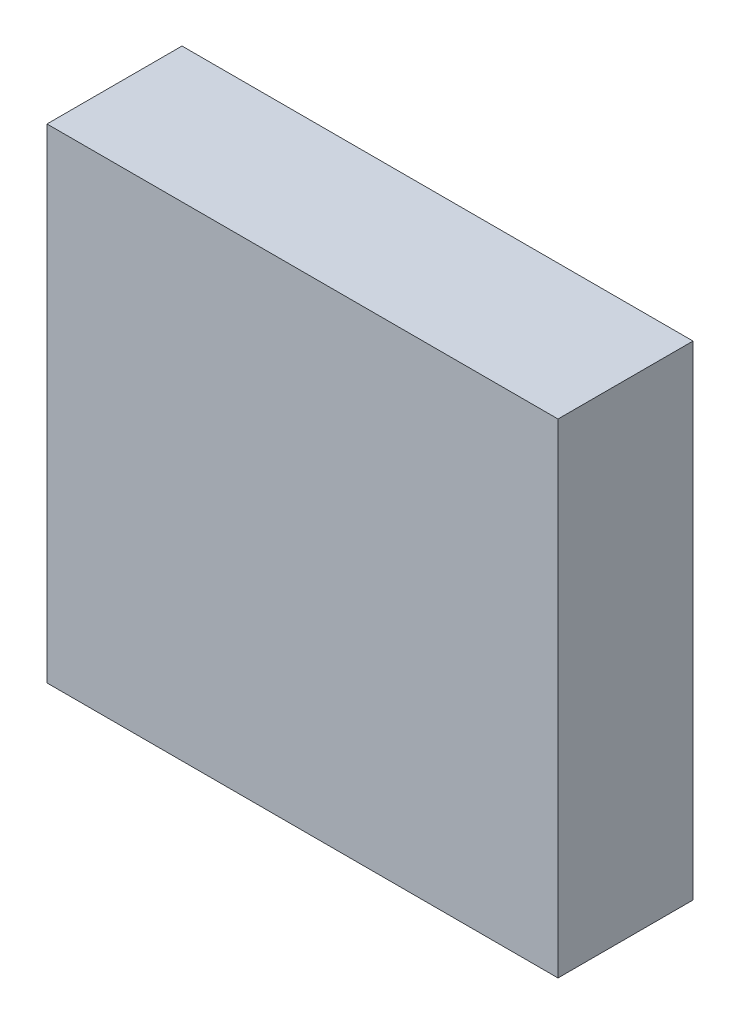
ISO-10303-21;
HEADER;
FILE_DESCRIPTION(('STEP AP214'),'2;1');
FILE_NAME('part.step','',(''),(''),'','','');
FILE_SCHEMA(('AUTOMOTIVE_DESIGN { 1 0 10303 214 1 1 1 1 }'));
ENDSEC;
DATA;
#1=APPLICATION_CONTEXT('core data for automotive mechanical design processes');
#2=APPLICATION_PROTOCOL_DEFINITION('international standard','automotive_design',2000,#1);
#3=PRODUCT_CONTEXT('',#1,'mechanical');
#4=PRODUCT('Part','Part','',(#3));
#5=PRODUCT_RELATED_PRODUCT_CATEGORY('part','',(#4));
#6=PRODUCT_DEFINITION_FORMATION('','',#4);
#7=PRODUCT_DEFINITION_CONTEXT('part definition',#1,'design');
#8=PRODUCT_DEFINITION('design','',#6,#7);
#9=PRODUCT_DEFINITION_SHAPE('','',#8);
#10=(LENGTH_UNIT() NAMED_UNIT(*) SI_UNIT(.MILLI.,.METRE.));
#11=(NAMED_UNIT(*) PLANE_ANGLE_UNIT() SI_UNIT($,.RADIAN.));
#12=(NAMED_UNIT(*) SI_UNIT($,.STERADIAN.) SOLID_ANGLE_UNIT());
#13=UNCERTAINTY_MEASURE_WITH_UNIT(LENGTH_MEASURE(1.E-05),#10,'distance_accuracy_value','');
#14=(GEOMETRIC_REPRESENTATION_CONTEXT(3) GLOBAL_UNCERTAINTY_ASSIGNED_CONTEXT((#13)) GLOBAL_UNIT_ASSIGNED_CONTEXT((#10,
#11,#12)) REPRESENTATION_CONTEXT('',''));
#15=CARTESIAN_POINT('',(0.,0.,0.));
#16=DIRECTION('',(0.,0.,1.));
#17=DIRECTION('',(1.,0.,0.));
#18=AXIS2_PLACEMENT_3D('',#15,#16,#17);
#19=CARTESIAN_POINT('',(0.,0.,0.));
#20=DIRECTION('',(0.,0.,-1.));
#21=DIRECTION('',(-1.,0.,0.));
#22=AXIS2_PLACEMENT_3D('',#19,#20,#21);
#23=PLANE('',#22);
#24=DIRECTION('',(0.,-1.,0.));
#25=VECTOR('',#24,1.);
#26=CARTESIAN_POINT('',(-47.5,45.,0.));
#27=LINE('',#26,#25);
#28=CARTESIAN_POINT('',(-47.5,45.,0.));
#29=VERTEX_POINT('',#28);
#30=CARTESIAN_POINT('',(-47.5,-45.,0.));
#31=VERTEX_POINT('',#30);
#32=EDGE_CURVE('E136',#29,#31,#27,.T.);
#33=ORIENTED_EDGE('',*,*,#32,.F.);
#34=DIRECTION('',(-1.,0.,0.));
#35=VECTOR('',#34,1.);
#36=CARTESIAN_POINT('',(47.5,45.,0.));
#37=LINE('',#36,#35);
#38=CARTESIAN_POINT('',(47.5,45.,0.));
#39=VERTEX_POINT('',#38);
#40=EDGE_CURVE('E84',#39,#29,#37,.T.);
#41=ORIENTED_EDGE('',*,*,#40,.F.);
#42=DIRECTION('',(0.,1.,0.));
#43=VECTOR('',#42,1.);
#44=CARTESIAN_POINT('',(47.5,45.,0.));
#45=LINE('',#44,#43);
#46=CARTESIAN_POINT('',(47.5,-45.,0.));
#47=VERTEX_POINT('',#46);
#48=EDGE_CURVE('E164',#47,#39,#45,.T.);
#49=ORIENTED_EDGE('',*,*,#48,.F.);
#50=DIRECTION('',(1.,0.,0.));
#51=VECTOR('',#50,1.);
#52=CARTESIAN_POINT('',(47.5,-45.,0.));
#53=LINE('',#52,#51);
#54=EDGE_CURVE('E140',#31,#47,#53,.T.);
#55=ORIENTED_EDGE('',*,*,#54,.F.);
#56=EDGE_LOOP('',(#33,#41,#49,#55));
#57=FACE_BOUND('',#56,.T.);
#58=DIRECTION('',(-1.,0.,0.));
#59=VECTOR('',#58,1.);
#60=CARTESIAN_POINT('',(0.,37.18,0.));
#61=LINE('',#60,#59);
#62=CARTESIAN_POINT('',(39.68,37.18,0.));
#63=VERTEX_POINT('',#62);
#64=CARTESIAN_POINT('',(-39.68,37.18,0.));
#65=VERTEX_POINT('',#64);
#66=EDGE_CURVE('E131',#63,#65,#61,.T.);
#67=ORIENTED_EDGE('',*,*,#66,.T.);
#68=DIRECTION('',(0.,-1.,0.));
#69=VECTOR('',#68,1.);
#70=CARTESIAN_POINT('',(-39.68,0.,0.));
#71=LINE('',#70,#69);
#72=CARTESIAN_POINT('',(-39.68,-37.18,0.));
#73=VERTEX_POINT('',#72);
#74=EDGE_CURVE('E150',#65,#73,#71,.T.);
#75=ORIENTED_EDGE('',*,*,#74,.T.);
#76=DIRECTION('',(1.,0.,0.));
#77=VECTOR('',#76,1.);
#78=CARTESIAN_POINT('',(0.,-37.18,0.));
#79=LINE('',#78,#77);
#80=CARTESIAN_POINT('',(39.68,-37.18,0.));
#81=VERTEX_POINT('',#80);
#82=EDGE_CURVE('E135',#73,#81,#79,.T.);
#83=ORIENTED_EDGE('',*,*,#82,.T.);
#84=DIRECTION('',(0.,1.,0.));
#85=VECTOR('',#84,1.);
#86=CARTESIAN_POINT('',(39.68,0.,0.));
#87=LINE('',#86,#85);
#88=EDGE_CURVE('E54',#81,#63,#87,.T.);
#89=ORIENTED_EDGE('',*,*,#88,.T.);
#90=EDGE_LOOP('',(#67,#75,#83,#89));
#91=FACE_BOUND('',#90,.T.);
#92=ADVANCED_FACE('F39',(#57,#91),#23,.T.);
#93=CARTESIAN_POINT('',(-47.5,45.,25.1));
#94=DIRECTION('',(1.,0.,0.));
#95=DIRECTION('',(0.,1.,0.));
#96=AXIS2_PLACEMENT_3D('',#93,#94,#95);
#97=PLANE('',#96);
#98=ORIENTED_EDGE('',*,*,#32,.T.);
#99=DIRECTION('',(0.,0.,-1.));
#100=VECTOR('',#99,1.);
#101=CARTESIAN_POINT('',(-47.5,-45.,25.1));
#102=LINE('',#101,#100);
#103=CARTESIAN_POINT('',(-47.5,-45.,25.1));
#104=VERTEX_POINT('',#103);
#105=EDGE_CURVE('E11',#104,#31,#102,.T.);
#106=ORIENTED_EDGE('',*,*,#105,.F.);
#107=DIRECTION('',(0.,-1.,0.));
#108=VECTOR('',#107,1.);
#109=CARTESIAN_POINT('',(-47.5,45.,25.1));
#110=LINE('',#109,#108);
#111=CARTESIAN_POINT('',(-47.5,45.,25.1));
#112=VERTEX_POINT('',#111);
#113=EDGE_CURVE('E156',#112,#104,#110,.T.);
#114=ORIENTED_EDGE('',*,*,#113,.F.);
#115=DIRECTION('',(0.,0.,-1.));
#116=VECTOR('',#115,1.);
#117=CARTESIAN_POINT('',(-47.5,45.,25.1));
#118=LINE('',#117,#116);
#119=EDGE_CURVE('E161',#112,#29,#118,.T.);
#120=ORIENTED_EDGE('',*,*,#119,.T.);
#121=EDGE_LOOP('',(#98,#106,#114,#120));
#122=FACE_BOUND('',#121,.T.);
#123=ADVANCED_FACE('F41',(#122),#97,.F.);
#124=CARTESIAN_POINT('',(47.5,-45.,25.1));
#125=DIRECTION('',(0.,1.,0.));
#126=DIRECTION('',(-1.,0.,0.));
#127=AXIS2_PLACEMENT_3D('',#124,#125,#126);
#128=PLANE('',#127);
#129=ORIENTED_EDGE('',*,*,#54,.T.);
#130=DIRECTION('',(0.,0.,-1.));
#131=VECTOR('',#130,1.);
#132=CARTESIAN_POINT('',(47.5,-45.,25.1));
#133=LINE('',#132,#131);
#134=CARTESIAN_POINT('',(47.5,-45.,25.1));
#135=VERTEX_POINT('',#134);
#136=EDGE_CURVE('E47',#135,#47,#133,.T.);
#137=ORIENTED_EDGE('',*,*,#136,.F.);
#138=DIRECTION('',(1.,0.,0.));
#139=VECTOR('',#138,1.);
#140=CARTESIAN_POINT('',(47.5,-45.,25.1));
#141=LINE('',#140,#139);
#142=EDGE_CURVE('E91',#104,#135,#141,.T.);
#143=ORIENTED_EDGE('',*,*,#142,.F.);
#144=ORIENTED_EDGE('',*,*,#105,.T.);
#145=EDGE_LOOP('',(#129,#137,#143,#144));
#146=FACE_BOUND('',#145,.T.);
#147=ADVANCED_FACE('F190',(#146),#128,.F.);
#148=CARTESIAN_POINT('',(47.5,45.,25.1));
#149=DIRECTION('',(-1.,0.,0.));
#150=DIRECTION('',(0.,-1.,0.));
#151=AXIS2_PLACEMENT_3D('',#148,#149,#150);
#152=PLANE('',#151);
#153=ORIENTED_EDGE('',*,*,#48,.T.);
#154=DIRECTION('',(0.,0.,-1.));
#155=VECTOR('',#154,1.);
#156=CARTESIAN_POINT('',(47.5,45.,25.1));
#157=LINE('',#156,#155);
#158=CARTESIAN_POINT('',(47.5,45.,25.1));
#159=VERTEX_POINT('',#158);
#160=EDGE_CURVE('E168',#159,#39,#157,.T.);
#161=ORIENTED_EDGE('',*,*,#160,.F.);
#162=DIRECTION('',(0.,1.,0.));
#163=VECTOR('',#162,1.);
#164=CARTESIAN_POINT('',(47.5,45.,25.1));
#165=LINE('',#164,#163);
#166=EDGE_CURVE('E159',#135,#159,#165,.T.);
#167=ORIENTED_EDGE('',*,*,#166,.F.);
#168=ORIENTED_EDGE('',*,*,#136,.T.);
#169=EDGE_LOOP('',(#153,#161,#167,#168));
#170=FACE_BOUND('',#169,.T.);
#171=ADVANCED_FACE('F173',(#170),#152,.F.);
#172=CARTESIAN_POINT('',(47.5,45.,25.1));
#173=DIRECTION('',(0.,-1.,0.));
#174=DIRECTION('',(1.,0.,0.));
#175=AXIS2_PLACEMENT_3D('',#172,#173,#174);
#176=PLANE('',#175);
#177=ORIENTED_EDGE('',*,*,#40,.T.);
#178=ORIENTED_EDGE('',*,*,#119,.F.);
#179=DIRECTION('',(-1.,0.,0.));
#180=VECTOR('',#179,1.);
#181=CARTESIAN_POINT('',(47.5,45.,25.1));
#182=LINE('',#181,#180);
#183=EDGE_CURVE('E63',#159,#112,#182,.T.);
#184=ORIENTED_EDGE('',*,*,#183,.F.);
#185=ORIENTED_EDGE('',*,*,#160,.T.);
#186=EDGE_LOOP('',(#177,#178,#184,#185));
#187=FACE_BOUND('',#186,.T.);
#188=ADVANCED_FACE('F181',(#187),#176,.F.);
#189=CARTESIAN_POINT('',(0.,0.,25.1));
#190=DIRECTION('',(0.,0.,-1.));
#191=DIRECTION('',(-1.,0.,0.));
#192=AXIS2_PLACEMENT_3D('',#189,#190,#191);
#193=PLANE('',#192);
#194=ORIENTED_EDGE('',*,*,#113,.T.);
#195=ORIENTED_EDGE('',*,*,#142,.T.);
#196=ORIENTED_EDGE('',*,*,#166,.T.);
#197=ORIENTED_EDGE('',*,*,#183,.T.);
#198=EDGE_LOOP('',(#194,#195,#196,#197));
#199=FACE_BOUND('',#198,.T.);
#200=ADVANCED_FACE('F183',(#199),#193,.F.);
#201=CARTESIAN_POINT('',(-39.68,45.,25.1));
#202=DIRECTION('',(1.,0.,0.));
#203=DIRECTION('',(0.,1.,0.));
#204=AXIS2_PLACEMENT_3D('',#201,#202,#203);
#205=PLANE('',#204);
#206=ORIENTED_EDGE('',*,*,#74,.F.);
#207=DIRECTION('',(0.,0.,-1.));
#208=VECTOR('',#207,1.);
#209=CARTESIAN_POINT('',(-39.68,37.18,25.1));
#210=LINE('',#209,#208);
#211=CARTESIAN_POINT('',(-39.68,37.18,14.31));
#212=VERTEX_POINT('',#211);
#213=EDGE_CURVE('E130',#212,#65,#210,.T.);
#214=ORIENTED_EDGE('',*,*,#213,.F.);
#215=DIRECTION('',(0.,-1.,0.));
#216=VECTOR('',#215,1.);
#217=CARTESIAN_POINT('',(-39.68,0.,14.31));
#218=LINE('',#217,#216);
#219=CARTESIAN_POINT('',(-39.68,-37.18,14.31));
#220=VERTEX_POINT('',#219);
#221=EDGE_CURVE('E118',#212,#220,#218,.T.);
#222=ORIENTED_EDGE('',*,*,#221,.T.);
#223=DIRECTION('',(0.,0.,-1.));
#224=VECTOR('',#223,1.);
#225=CARTESIAN_POINT('',(-39.68,-37.18,25.1));
#226=LINE('',#225,#224);
#227=EDGE_CURVE('E128',#220,#73,#226,.T.);
#228=ORIENTED_EDGE('',*,*,#227,.T.);
#229=EDGE_LOOP('',(#206,#214,#222,#228));
#230=FACE_BOUND('',#229,.T.);
#231=ADVANCED_FACE('F127',(#230),#205,.T.);
#232=CARTESIAN_POINT('',(47.5,-37.18,25.1));
#233=DIRECTION('',(0.,1.,0.));
#234=DIRECTION('',(-1.,0.,0.));
#235=AXIS2_PLACEMENT_3D('',#232,#233,#234);
#236=PLANE('',#235);
#237=ORIENTED_EDGE('',*,*,#82,.F.);
#238=ORIENTED_EDGE('',*,*,#227,.F.);
#239=DIRECTION('',(1.,0.,0.));
#240=VECTOR('',#239,1.);
#241=CARTESIAN_POINT('',(0.,-37.18,14.31));
#242=LINE('',#241,#240);
#243=CARTESIAN_POINT('',(39.68,-37.18,14.31));
#244=VERTEX_POINT('',#243);
#245=EDGE_CURVE('E114',#220,#244,#242,.T.);
#246=ORIENTED_EDGE('',*,*,#245,.T.);
#247=DIRECTION('',(0.,0.,-1.));
#248=VECTOR('',#247,1.);
#249=CARTESIAN_POINT('',(39.68,-37.18,25.1));
#250=LINE('',#249,#248);
#251=EDGE_CURVE('E137',#244,#81,#250,.T.);
#252=ORIENTED_EDGE('',*,*,#251,.T.);
#253=EDGE_LOOP('',(#237,#238,#246,#252));
#254=FACE_BOUND('',#253,.T.);
#255=ADVANCED_FACE('F133',(#254),#236,.T.);
#256=CARTESIAN_POINT('',(39.68,45.,25.1));
#257=DIRECTION('',(-1.,0.,0.));
#258=DIRECTION('',(0.,-1.,0.));
#259=AXIS2_PLACEMENT_3D('',#256,#257,#258);
#260=PLANE('',#259);
#261=ORIENTED_EDGE('',*,*,#88,.F.);
#262=ORIENTED_EDGE('',*,*,#251,.F.);
#263=DIRECTION('',(0.,1.,0.));
#264=VECTOR('',#263,1.);
#265=CARTESIAN_POINT('',(39.68,0.,14.31));
#266=LINE('',#265,#264);
#267=CARTESIAN_POINT('',(39.68,37.18,14.31));
#268=VERTEX_POINT('',#267);
#269=EDGE_CURVE('E119',#244,#268,#266,.T.);
#270=ORIENTED_EDGE('',*,*,#269,.T.);
#271=DIRECTION('',(0.,0.,-1.));
#272=VECTOR('',#271,1.);
#273=CARTESIAN_POINT('',(39.68,37.18,25.1));
#274=LINE('',#273,#272);
#275=EDGE_CURVE('E142',#268,#63,#274,.T.);
#276=ORIENTED_EDGE('',*,*,#275,.T.);
#277=EDGE_LOOP('',(#261,#262,#270,#276));
#278=FACE_BOUND('',#277,.T.);
#279=ADVANCED_FACE('F203',(#278),#260,.T.);
#280=CARTESIAN_POINT('',(47.5,37.18,25.1));
#281=DIRECTION('',(0.,-1.,0.));
#282=DIRECTION('',(1.,0.,0.));
#283=AXIS2_PLACEMENT_3D('',#280,#281,#282);
#284=PLANE('',#283);
#285=ORIENTED_EDGE('',*,*,#66,.F.);
#286=ORIENTED_EDGE('',*,*,#275,.F.);
#287=DIRECTION('',(-1.,0.,0.));
#288=VECTOR('',#287,1.);
#289=CARTESIAN_POINT('',(0.,37.18,14.31));
#290=LINE('',#289,#288);
#291=EDGE_CURVE('E145',#268,#212,#290,.T.);
#292=ORIENTED_EDGE('',*,*,#291,.T.);
#293=ORIENTED_EDGE('',*,*,#213,.T.);
#294=EDGE_LOOP('',(#285,#286,#292,#293));
#295=FACE_BOUND('',#294,.T.);
#296=ADVANCED_FACE('F200',(#295),#284,.T.);
#297=CARTESIAN_POINT('',(0.,0.,14.31));
#298=DIRECTION('',(0.,0.,-1.));
#299=DIRECTION('',(-1.,0.,0.));
#300=AXIS2_PLACEMENT_3D('',#297,#298,#299);
#301=PLANE('',#300);
#302=ORIENTED_EDGE('',*,*,#221,.F.);
#303=ORIENTED_EDGE('',*,*,#291,.F.);
#304=ORIENTED_EDGE('',*,*,#269,.F.);
#305=ORIENTED_EDGE('',*,*,#245,.F.);
#306=EDGE_LOOP('',(#302,#303,#304,#305));
#307=FACE_BOUND('',#306,.T.);
#308=ADVANCED_FACE('F116',(#307),#301,.T.);
#309=CLOSED_SHELL('',(#92,#123,#147,#171,#188,#200,#231,#255,#279,#296,#308));
#310=MANIFOLD_SOLID_BREP('B2',#309);
#311=ADVANCED_BREP_SHAPE_REPRESENTATION('',(#18,#310),#14);
#312=SHAPE_DEFINITION_REPRESENTATION(#9,#311);
ENDSEC;
END-ISO-10303-21;
